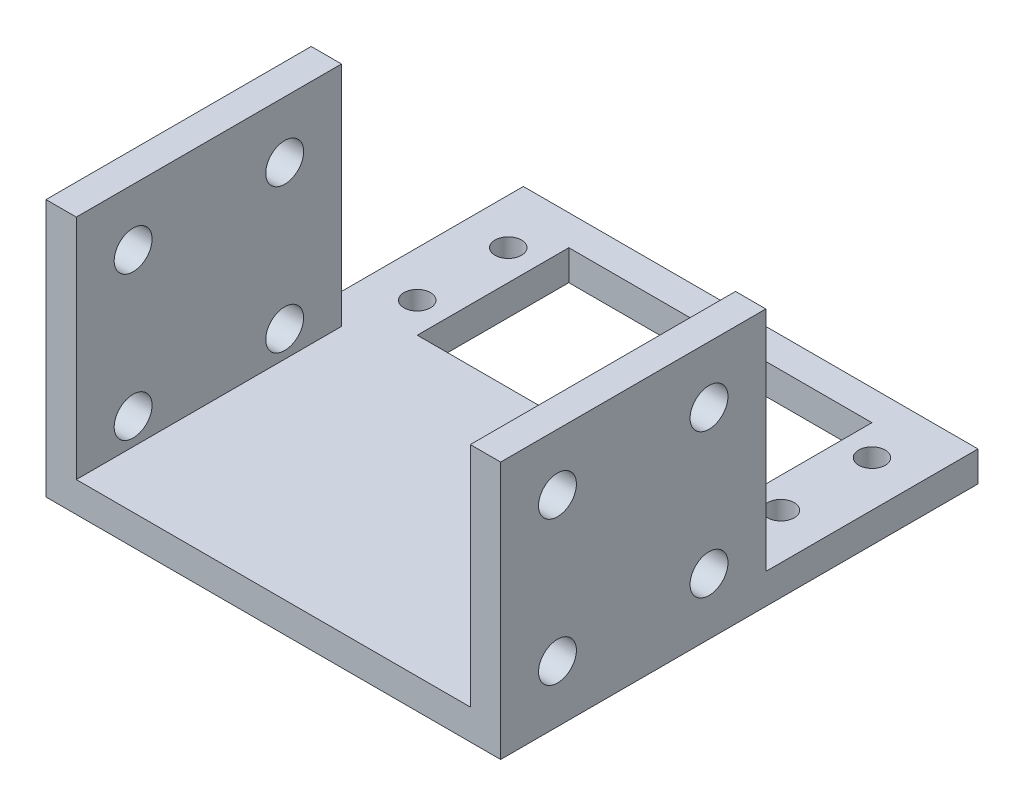
ISO-10303-21;
HEADER;
FILE_DESCRIPTION(('STEP AP214'),'2;1');
FILE_NAME('part.step','',(''),(''),'','','');
FILE_SCHEMA(('AUTOMOTIVE_DESIGN { 1 0 10303 214 1 1 1 1 }'));
ENDSEC;
DATA;
#1=APPLICATION_CONTEXT('core data for automotive mechanical design processes');
#2=APPLICATION_PROTOCOL_DEFINITION('international standard','automotive_design',2000,#1);
#3=PRODUCT_CONTEXT('',#1,'mechanical');
#4=PRODUCT('Part','Part','',(#3));
#5=PRODUCT_RELATED_PRODUCT_CATEGORY('part','',(#4));
#6=PRODUCT_DEFINITION_FORMATION('','',#4);
#7=PRODUCT_DEFINITION_CONTEXT('part definition',#1,'design');
#8=PRODUCT_DEFINITION('design','',#6,#7);
#9=PRODUCT_DEFINITION_SHAPE('','',#8);
#10=(LENGTH_UNIT() NAMED_UNIT(*) SI_UNIT(.MILLI.,.METRE.));
#11=(NAMED_UNIT(*) PLANE_ANGLE_UNIT() SI_UNIT($,.RADIAN.));
#12=(NAMED_UNIT(*) SI_UNIT($,.STERADIAN.) SOLID_ANGLE_UNIT());
#13=UNCERTAINTY_MEASURE_WITH_UNIT(LENGTH_MEASURE(1.E-05),#10,'distance_accuracy_value','');
#14=(GEOMETRIC_REPRESENTATION_CONTEXT(3) GLOBAL_UNCERTAINTY_ASSIGNED_CONTEXT((#13)) GLOBAL_UNIT_ASSIGNED_CONTEXT((#10,
#11,#12)) REPRESENTATION_CONTEXT('',''));
#15=CARTESIAN_POINT('',(0.,0.,0.));
#16=DIRECTION('',(0.,0.,1.));
#17=DIRECTION('',(1.,0.,0.));
#18=AXIS2_PLACEMENT_3D('',#15,#16,#17);
#19=CARTESIAN_POINT('',(20.,4.,0.));
#20=DIRECTION('',(-1.,0.,0.));
#21=DIRECTION('',(0.,0.,1.));
#22=AXIS2_PLACEMENT_3D('',#19,#20,#21);
#23=PLANE('',#22);
#24=DIRECTION('',(0.,0.,-1.));
#25=VECTOR('',#24,1.);
#26=CARTESIAN_POINT('',(20.,0.,0.));
#27=LINE('',#26,#25);
#28=CARTESIAN_POINT('',(20.,0.,10.));
#29=VERTEX_POINT('',#28);
#30=CARTESIAN_POINT('',(20.,0.,-10.));
#31=VERTEX_POINT('',#30);
#32=EDGE_CURVE('E168',#29,#31,#27,.T.);
#33=ORIENTED_EDGE('',*,*,#32,.F.);
#34=DIRECTION('',(0.,-1.,0.));
#35=VECTOR('',#34,1.);
#36=CARTESIAN_POINT('',(20.,4.,10.));
#37=LINE('',#36,#35);
#38=CARTESIAN_POINT('',(20.,4.,10.));
#39=VERTEX_POINT('',#38);
#40=EDGE_CURVE('E11',#39,#29,#37,.T.);
#41=ORIENTED_EDGE('',*,*,#40,.F.);
#42=DIRECTION('',(0.,0.,-1.));
#43=VECTOR('',#42,1.);
#44=CARTESIAN_POINT('',(20.,4.,0.));
#45=LINE('',#44,#43);
#46=CARTESIAN_POINT('',(20.,4.,-10.));
#47=VERTEX_POINT('',#46);
#48=EDGE_CURVE('E135',#39,#47,#45,.T.);
#49=ORIENTED_EDGE('',*,*,#48,.T.);
#50=DIRECTION('',(0.,-1.,0.));
#51=VECTOR('',#50,1.);
#52=CARTESIAN_POINT('',(20.,4.,-10.));
#53=LINE('',#52,#51);
#54=EDGE_CURVE('E90',#47,#31,#53,.T.);
#55=ORIENTED_EDGE('',*,*,#54,.T.);
#56=EDGE_LOOP('',(#33,#41,#49,#55));
#57=FACE_BOUND('',#56,.T.);
#58=ADVANCED_FACE('F41',(#57),#23,.T.);
#59=CARTESIAN_POINT('',(0.,4.,10.));
#60=DIRECTION('',(0.,0.,-1.));
#61=DIRECTION('',(-1.,0.,0.));
#62=AXIS2_PLACEMENT_3D('',#59,#60,#61);
#63=PLANE('',#62);
#64=DIRECTION('',(1.,0.,0.));
#65=VECTOR('',#64,1.);
#66=CARTESIAN_POINT('',(0.,0.,10.));
#67=LINE('',#66,#65);
#68=CARTESIAN_POINT('',(-20.,0.,10.));
#69=VERTEX_POINT('',#68);
#70=EDGE_CURVE('E124',#69,#29,#67,.T.);
#71=ORIENTED_EDGE('',*,*,#70,.F.);
#72=DIRECTION('',(0.,-1.,0.));
#73=VECTOR('',#72,1.);
#74=CARTESIAN_POINT('',(-20.,4.,10.));
#75=LINE('',#74,#73);
#76=CARTESIAN_POINT('',(-20.,4.,10.));
#77=VERTEX_POINT('',#76);
#78=EDGE_CURVE('E51',#77,#69,#75,.T.);
#79=ORIENTED_EDGE('',*,*,#78,.F.);
#80=DIRECTION('',(1.,0.,0.));
#81=VECTOR('',#80,1.);
#82=CARTESIAN_POINT('',(0.,4.,10.));
#83=LINE('',#82,#81);
#84=EDGE_CURVE('E122',#77,#39,#83,.T.);
#85=ORIENTED_EDGE('',*,*,#84,.T.);
#86=ORIENTED_EDGE('',*,*,#40,.T.);
#87=EDGE_LOOP('',(#71,#79,#85,#86));
#88=FACE_BOUND('',#87,.T.);
#89=ADVANCED_FACE('F120',(#88),#63,.T.);
#90=CARTESIAN_POINT('',(-20.,4.,0.));
#91=DIRECTION('',(-1.,0.,0.));
#92=DIRECTION('',(0.,0.,1.));
#93=AXIS2_PLACEMENT_3D('',#90,#91,#92);
#94=PLANE('',#93);
#95=DIRECTION('',(0.,0.,-1.));
#96=VECTOR('',#95,1.);
#97=CARTESIAN_POINT('',(-20.,0.,0.));
#98=LINE('',#97,#96);
#99=CARTESIAN_POINT('',(-20.,0.,-10.));
#100=VERTEX_POINT('',#99);
#101=EDGE_CURVE('E171',#69,#100,#98,.T.);
#102=ORIENTED_EDGE('',*,*,#101,.T.);
#103=DIRECTION('',(0.,-1.,0.));
#104=VECTOR('',#103,1.);
#105=CARTESIAN_POINT('',(-20.,4.,-10.));
#106=LINE('',#105,#104);
#107=CARTESIAN_POINT('',(-20.,4.,-10.));
#108=VERTEX_POINT('',#107);
#109=EDGE_CURVE('E127',#108,#100,#106,.T.);
#110=ORIENTED_EDGE('',*,*,#109,.F.);
#111=DIRECTION('',(0.,0.,-1.));
#112=VECTOR('',#111,1.);
#113=CARTESIAN_POINT('',(-20.,4.,0.));
#114=LINE('',#113,#112);
#115=EDGE_CURVE('E130',#77,#108,#114,.T.);
#116=ORIENTED_EDGE('',*,*,#115,.F.);
#117=ORIENTED_EDGE('',*,*,#78,.T.);
#118=EDGE_LOOP('',(#102,#110,#116,#117));
#119=FACE_BOUND('',#118,.T.);
#120=ADVANCED_FACE('F131',(#119),#94,.F.);
#121=CARTESIAN_POINT('',(30.,4.,0.));
#122=DIRECTION('',(1.,0.,0.));
#123=DIRECTION('',(0.,0.,-1.));
#124=AXIS2_PLACEMENT_3D('',#121,#122,#123);
#125=PLANE('',#124);
#126=CARTESIAN_POINT('',(30.,7.5,41.5));
#127=DIRECTION('',(1.,0.,0.));
#128=DIRECTION('',(0.,0.,-1.));
#129=AXIS2_PLACEMENT_3D('',#126,#127,#128);
#130=CIRCLE('',#129,2.5);
#131=CARTESIAN_POINT('',(30.,7.5,39.));
#132=VERTEX_POINT('',#131);
#133=EDGE_CURVE('E440',#132,#132,#130,.T.);
#134=ORIENTED_EDGE('',*,*,#133,.F.);
#135=EDGE_LOOP('',(#134));
#136=FACE_BOUND('',#135,.T.);
#137=CARTESIAN_POINT('',(30.,7.5,21.5));
#138=DIRECTION('',(1.,0.,0.));
#139=DIRECTION('',(0.,0.,-1.));
#140=AXIS2_PLACEMENT_3D('',#137,#138,#139);
#141=CIRCLE('',#140,2.5);
#142=CARTESIAN_POINT('',(30.,7.5,19.));
#143=VERTEX_POINT('',#142);
#144=EDGE_CURVE('E446',#143,#143,#141,.T.);
#145=ORIENTED_EDGE('',*,*,#144,.F.);
#146=EDGE_LOOP('',(#145));
#147=FACE_BOUND('',#146,.T.);
#148=CARTESIAN_POINT('',(30.,26.5,21.5));
#149=DIRECTION('',(1.,0.,0.));
#150=DIRECTION('',(0.,0.,-1.));
#151=AXIS2_PLACEMENT_3D('',#148,#149,#150);
#152=CIRCLE('',#151,2.5);
#153=CARTESIAN_POINT('',(30.,26.5,19.));
#154=VERTEX_POINT('',#153);
#155=EDGE_CURVE('E435',#154,#154,#152,.T.);
#156=ORIENTED_EDGE('',*,*,#155,.F.);
#157=EDGE_LOOP('',(#156));
#158=FACE_BOUND('',#157,.T.);
#159=CARTESIAN_POINT('',(30.,26.5,41.5));
#160=DIRECTION('',(1.,0.,0.));
#161=DIRECTION('',(0.,0.,-1.));
#162=AXIS2_PLACEMENT_3D('',#159,#160,#161);
#163=CIRCLE('',#162,2.5);
#164=CARTESIAN_POINT('',(30.,26.5,39.));
#165=VERTEX_POINT('',#164);
#166=EDGE_CURVE('E432',#165,#165,#163,.T.);
#167=ORIENTED_EDGE('',*,*,#166,.F.);
#168=EDGE_LOOP('',(#167));
#169=FACE_BOUND('',#168,.T.);
#170=DIRECTION('',(0.,0.,1.));
#171=VECTOR('',#170,1.);
#172=CARTESIAN_POINT('',(30.,0.,0.));
#173=LINE('',#172,#171);
#174=CARTESIAN_POINT('',(30.,0.,-14.));
#175=VERTEX_POINT('',#174);
#176=CARTESIAN_POINT('',(30.,0.,49.));
#177=VERTEX_POINT('',#176);
#178=EDGE_CURVE('E149',#175,#177,#173,.T.);
#179=ORIENTED_EDGE('',*,*,#178,.F.);
#180=DIRECTION('',(0.,-1.,0.));
#181=VECTOR('',#180,1.);
#182=CARTESIAN_POINT('',(30.,4.,-14.));
#183=LINE('',#182,#181);
#184=CARTESIAN_POINT('',(30.,4.,-14.));
#185=VERTEX_POINT('',#184);
#186=EDGE_CURVE('E97',#185,#175,#183,.T.);
#187=ORIENTED_EDGE('',*,*,#186,.F.);
#188=DIRECTION('',(0.,0.,1.));
#189=VECTOR('',#188,1.);
#190=CARTESIAN_POINT('',(30.,4.,0.));
#191=LINE('',#190,#189);
#192=CARTESIAN_POINT('',(30.,4.,14.));
#193=VERTEX_POINT('',#192);
#194=EDGE_CURVE('E262',#185,#193,#191,.T.);
#195=ORIENTED_EDGE('',*,*,#194,.T.);
#196=DIRECTION('',(0.,-1.,0.));
#197=VECTOR('',#196,1.);
#198=CARTESIAN_POINT('',(30.,34.,14.));
#199=LINE('',#198,#197);
#200=CARTESIAN_POINT('',(30.,34.,14.));
#201=VERTEX_POINT('',#200);
#202=EDGE_CURVE('E224',#201,#193,#199,.T.);
#203=ORIENTED_EDGE('',*,*,#202,.F.);
#204=DIRECTION('',(0.,0.,1.));
#205=VECTOR('',#204,1.);
#206=CARTESIAN_POINT('',(30.,34.,0.));
#207=LINE('',#206,#205);
#208=CARTESIAN_POINT('',(30.,34.,49.));
#209=VERTEX_POINT('',#208);
#210=EDGE_CURVE('E221',#201,#209,#207,.T.);
#211=ORIENTED_EDGE('',*,*,#210,.T.);
#212=DIRECTION('',(0.,-1.,0.));
#213=VECTOR('',#212,1.);
#214=CARTESIAN_POINT('',(30.,34.,49.));
#215=LINE('',#214,#213);
#216=EDGE_CURVE('E227',#209,#177,#215,.T.);
#217=ORIENTED_EDGE('',*,*,#216,.T.);
#218=EDGE_LOOP('',(#179,#187,#195,#203,#211,#217));
#219=FACE_BOUND('',#218,.T.);
#220=ADVANCED_FACE('F43',(#136,#147,#158,#169,#219),#125,.T.);
#221=CARTESIAN_POINT('',(0.,4.,-14.));
#222=DIRECTION('',(0.,0.,-1.));
#223=DIRECTION('',(-1.,0.,0.));
#224=AXIS2_PLACEMENT_3D('',#221,#222,#223);
#225=PLANE('',#224);
#226=DIRECTION('',(1.,0.,0.));
#227=VECTOR('',#226,1.);
#228=CARTESIAN_POINT('',(0.,0.,-14.));
#229=LINE('',#228,#227);
#230=CARTESIAN_POINT('',(-30.,0.,-14.));
#231=VERTEX_POINT('',#230);
#232=EDGE_CURVE('E152',#231,#175,#229,.T.);
#233=ORIENTED_EDGE('',*,*,#232,.F.);
#234=DIRECTION('',(0.,-1.,0.));
#235=VECTOR('',#234,1.);
#236=CARTESIAN_POINT('',(-30.,4.,-14.));
#237=LINE('',#236,#235);
#238=CARTESIAN_POINT('',(-30.,4.,-14.));
#239=VERTEX_POINT('',#238);
#240=EDGE_CURVE('E148',#239,#231,#237,.T.);
#241=ORIENTED_EDGE('',*,*,#240,.F.);
#242=DIRECTION('',(1.,0.,0.));
#243=VECTOR('',#242,1.);
#244=CARTESIAN_POINT('',(0.,4.,-14.));
#245=LINE('',#244,#243);
#246=EDGE_CURVE('E265',#239,#185,#245,.T.);
#247=ORIENTED_EDGE('',*,*,#246,.T.);
#248=ORIENTED_EDGE('',*,*,#186,.T.);
#249=EDGE_LOOP('',(#233,#241,#247,#248));
#250=FACE_BOUND('',#249,.T.);
#251=ADVANCED_FACE('F322',(#250),#225,.T.);
#252=CARTESIAN_POINT('',(-30.,4.,0.));
#253=DIRECTION('',(1.,0.,0.));
#254=DIRECTION('',(0.,0.,-1.));
#255=AXIS2_PLACEMENT_3D('',#252,#253,#254);
#256=PLANE('',#255);
#257=CARTESIAN_POINT('',(-30.,7.5,41.5));
#258=DIRECTION('',(1.,0.,0.));
#259=DIRECTION('',(0.,0.,-1.));
#260=AXIS2_PLACEMENT_3D('',#257,#258,#259);
#261=CIRCLE('',#260,2.5);
#262=CARTESIAN_POINT('',(-30.,7.5,39.));
#263=VERTEX_POINT('',#262);
#264=EDGE_CURVE('E437',#263,#263,#261,.T.);
#265=ORIENTED_EDGE('',*,*,#264,.T.);
#266=EDGE_LOOP('',(#265));
#267=FACE_BOUND('',#266,.T.);
#268=CARTESIAN_POINT('',(-30.,7.5,21.5));
#269=DIRECTION('',(1.,0.,0.));
#270=DIRECTION('',(0.,0.,-1.));
#271=AXIS2_PLACEMENT_3D('',#268,#269,#270);
#272=CIRCLE('',#271,2.5);
#273=CARTESIAN_POINT('',(-30.,7.5,19.));
#274=VERTEX_POINT('',#273);
#275=EDGE_CURVE('E443',#274,#274,#272,.T.);
#276=ORIENTED_EDGE('',*,*,#275,.T.);
#277=EDGE_LOOP('',(#276));
#278=FACE_BOUND('',#277,.T.);
#279=CARTESIAN_POINT('',(-30.,26.5,21.5));
#280=DIRECTION('',(1.,0.,0.));
#281=DIRECTION('',(0.,0.,-1.));
#282=AXIS2_PLACEMENT_3D('',#279,#280,#281);
#283=CIRCLE('',#282,2.5);
#284=CARTESIAN_POINT('',(-30.,26.5,19.));
#285=VERTEX_POINT('',#284);
#286=EDGE_CURVE('E449',#285,#285,#283,.T.);
#287=ORIENTED_EDGE('',*,*,#286,.T.);
#288=EDGE_LOOP('',(#287));
#289=FACE_BOUND('',#288,.T.);
#290=CARTESIAN_POINT('',(-30.,26.5,41.5));
#291=DIRECTION('',(1.,0.,0.));
#292=DIRECTION('',(0.,0.,-1.));
#293=AXIS2_PLACEMENT_3D('',#290,#291,#292);
#294=CIRCLE('',#293,2.5);
#295=CARTESIAN_POINT('',(-30.,26.5,39.));
#296=VERTEX_POINT('',#295);
#297=EDGE_CURVE('E189',#296,#296,#294,.T.);
#298=ORIENTED_EDGE('',*,*,#297,.T.);
#299=EDGE_LOOP('',(#298));
#300=FACE_BOUND('',#299,.T.);
#301=DIRECTION('',(0.,0.,1.));
#302=VECTOR('',#301,1.);
#303=CARTESIAN_POINT('',(-30.,0.,0.));
#304=LINE('',#303,#302);
#305=CARTESIAN_POINT('',(-30.,0.,49.));
#306=VERTEX_POINT('',#305);
#307=EDGE_CURVE('E156',#231,#306,#304,.T.);
#308=ORIENTED_EDGE('',*,*,#307,.T.);
#309=DIRECTION('',(0.,-1.,0.));
#310=VECTOR('',#309,1.);
#311=CARTESIAN_POINT('',(-30.,34.,49.));
#312=LINE('',#311,#310);
#313=CARTESIAN_POINT('',(-30.,34.,49.));
#314=VERTEX_POINT('',#313);
#315=EDGE_CURVE('E249',#314,#306,#312,.T.);
#316=ORIENTED_EDGE('',*,*,#315,.F.);
#317=DIRECTION('',(0.,0.,1.));
#318=VECTOR('',#317,1.);
#319=CARTESIAN_POINT('',(-30.,34.,0.));
#320=LINE('',#319,#318);
#321=CARTESIAN_POINT('',(-30.,34.,14.));
#322=VERTEX_POINT('',#321);
#323=EDGE_CURVE('E240',#322,#314,#320,.T.);
#324=ORIENTED_EDGE('',*,*,#323,.F.);
#325=DIRECTION('',(0.,-1.,0.));
#326=VECTOR('',#325,1.);
#327=CARTESIAN_POINT('',(-30.,34.,14.));
#328=LINE('',#327,#326);
#329=CARTESIAN_POINT('',(-30.,4.,14.));
#330=VERTEX_POINT('',#329);
#331=EDGE_CURVE('E252',#322,#330,#328,.T.);
#332=ORIENTED_EDGE('',*,*,#331,.T.);
#333=DIRECTION('',(0.,0.,1.));
#334=VECTOR('',#333,1.);
#335=CARTESIAN_POINT('',(-30.,4.,0.));
#336=LINE('',#335,#334);
#337=EDGE_CURVE('E268',#239,#330,#336,.T.);
#338=ORIENTED_EDGE('',*,*,#337,.F.);
#339=ORIENTED_EDGE('',*,*,#240,.T.);
#340=EDGE_LOOP('',(#308,#316,#324,#332,#338,#339));
#341=FACE_BOUND('',#340,.T.);
#342=ADVANCED_FACE('F319',(#267,#278,#289,#300,#341),#256,.F.);
#343=CARTESIAN_POINT('',(24.,4.,6.00709049106582));
#344=DIRECTION('',(0.,-1.,0.));
#345=DIRECTION('',(0.,0.,-1.));
#346=AXIS2_PLACEMENT_3D('',#343,#344,#345);
#347=CYLINDRICAL_SURFACE('',#346,1.75);
#348=CARTESIAN_POINT('',(24.,4.,6.00709049106582));
#349=DIRECTION('',(0.,1.,0.));
#350=DIRECTION('',(0.,0.,1.));
#351=AXIS2_PLACEMENT_3D('',#348,#349,#350);
#352=CIRCLE('',#351,1.75);
#353=CARTESIAN_POINT('',(24.,4.,7.75709049106582));
#354=VERTEX_POINT('',#353);
#355=EDGE_CURVE('E142',#354,#354,#352,.T.);
#356=ORIENTED_EDGE('',*,*,#355,.T.);
#357=EDGE_LOOP('',(#356));
#358=FACE_BOUND('',#357,.T.);
#359=CARTESIAN_POINT('',(24.,0.,6.00709049106582));
#360=DIRECTION('',(0.,1.,0.));
#361=DIRECTION('',(0.,0.,1.));
#362=AXIS2_PLACEMENT_3D('',#359,#360,#361);
#363=CIRCLE('',#362,1.75);
#364=CARTESIAN_POINT('',(24.,0.,7.75709049106582));
#365=VERTEX_POINT('',#364);
#366=EDGE_CURVE('E174',#365,#365,#363,.T.);
#367=ORIENTED_EDGE('',*,*,#366,.F.);
#368=EDGE_LOOP('',(#367));
#369=FACE_BOUND('',#368,.T.);
#370=ADVANCED_FACE('F321',(#358,#369),#347,.F.);
#371=CARTESIAN_POINT('',(0.,4.,-10.));
#372=DIRECTION('',(0.,0.,-1.));
#373=DIRECTION('',(-1.,0.,0.));
#374=AXIS2_PLACEMENT_3D('',#371,#372,#373);
#375=PLANE('',#374);
#376=DIRECTION('',(1.,0.,0.));
#377=VECTOR('',#376,1.);
#378=CARTESIAN_POINT('',(0.,0.,-10.));
#379=LINE('',#378,#377);
#380=EDGE_CURVE('E83',#100,#31,#379,.T.);
#381=ORIENTED_EDGE('',*,*,#380,.T.);
#382=ORIENTED_EDGE('',*,*,#54,.F.);
#383=DIRECTION('',(1.,0.,0.));
#384=VECTOR('',#383,1.);
#385=CARTESIAN_POINT('',(0.,4.,-10.));
#386=LINE('',#385,#384);
#387=EDGE_CURVE('E60',#108,#47,#386,.T.);
#388=ORIENTED_EDGE('',*,*,#387,.F.);
#389=ORIENTED_EDGE('',*,*,#109,.T.);
#390=EDGE_LOOP('',(#381,#382,#388,#389));
#391=FACE_BOUND('',#390,.T.);
#392=ADVANCED_FACE('F313',(#391),#375,.F.);
#393=CARTESIAN_POINT('',(-24.,4.,-6.00709049106583));
#394=DIRECTION('',(0.,-1.,0.));
#395=DIRECTION('',(0.,0.,-1.));
#396=AXIS2_PLACEMENT_3D('',#393,#394,#395);
#397=CYLINDRICAL_SURFACE('',#396,1.75);
#398=CARTESIAN_POINT('',(-24.,4.,-6.00709049106583));
#399=DIRECTION('',(0.,1.,0.));
#400=DIRECTION('',(0.,0.,1.));
#401=AXIS2_PLACEMENT_3D('',#398,#399,#400);
#402=CIRCLE('',#401,1.75);
#403=CARTESIAN_POINT('',(-24.,4.,-4.25709049106583));
#404=VERTEX_POINT('',#403);
#405=EDGE_CURVE('E137',#404,#404,#402,.T.);
#406=ORIENTED_EDGE('',*,*,#405,.T.);
#407=EDGE_LOOP('',(#406));
#408=FACE_BOUND('',#407,.T.);
#409=CARTESIAN_POINT('',(-24.,0.,-6.00709049106583));
#410=DIRECTION('',(0.,1.,0.));
#411=DIRECTION('',(0.,0.,1.));
#412=AXIS2_PLACEMENT_3D('',#409,#410,#411);
#413=CIRCLE('',#412,1.75);
#414=CARTESIAN_POINT('',(-24.,0.,-4.25709049106583));
#415=VERTEX_POINT('',#414);
#416=EDGE_CURVE('E165',#415,#415,#413,.T.);
#417=ORIENTED_EDGE('',*,*,#416,.F.);
#418=EDGE_LOOP('',(#417));
#419=FACE_BOUND('',#418,.T.);
#420=ADVANCED_FACE('F280',(#408,#419),#397,.F.);
#421=CARTESIAN_POINT('',(-24.,4.,6.00709049106583));
#422=DIRECTION('',(0.,-1.,0.));
#423=DIRECTION('',(0.,0.,-1.));
#424=AXIS2_PLACEMENT_3D('',#421,#422,#423);
#425=CYLINDRICAL_SURFACE('',#424,1.75);
#426=CARTESIAN_POINT('',(-24.,4.,6.00709049106583));
#427=DIRECTION('',(0.,1.,0.));
#428=DIRECTION('',(0.,0.,1.));
#429=AXIS2_PLACEMENT_3D('',#426,#427,#428);
#430=CIRCLE('',#429,1.75);
#431=CARTESIAN_POINT('',(-24.,4.,7.75709049106583));
#432=VERTEX_POINT('',#431);
#433=EDGE_CURVE('E275',#432,#432,#430,.F.);
#434=ORIENTED_EDGE('',*,*,#433,.F.);
#435=EDGE_LOOP('',(#434));
#436=FACE_BOUND('',#435,.T.);
#437=CARTESIAN_POINT('',(-24.,0.,6.00709049106583));
#438=DIRECTION('',(0.,1.,0.));
#439=DIRECTION('',(0.,0.,1.));
#440=AXIS2_PLACEMENT_3D('',#437,#438,#439);
#441=CIRCLE('',#440,1.75);
#442=CARTESIAN_POINT('',(-24.,0.,7.75709049106583));
#443=VERTEX_POINT('',#442);
#444=EDGE_CURVE('E162',#443,#443,#441,.F.);
#445=ORIENTED_EDGE('',*,*,#444,.T.);
#446=EDGE_LOOP('',(#445));
#447=FACE_BOUND('',#446,.T.);
#448=ADVANCED_FACE('F312',(#436,#447),#425,.F.);
#449=CARTESIAN_POINT('',(0.,4.,49.));
#450=DIRECTION('',(0.,0.,-1.));
#451=DIRECTION('',(-1.,0.,0.));
#452=AXIS2_PLACEMENT_3D('',#449,#450,#451);
#453=PLANE('',#452);
#454=DIRECTION('',(1.,0.,0.));
#455=VECTOR('',#454,1.);
#456=CARTESIAN_POINT('',(0.,0.,49.));
#457=LINE('',#456,#455);
#458=EDGE_CURVE('E159',#306,#177,#457,.T.);
#459=ORIENTED_EDGE('',*,*,#458,.T.);
#460=ORIENTED_EDGE('',*,*,#216,.F.);
#461=DIRECTION('',(1.,0.,0.));
#462=VECTOR('',#461,1.);
#463=CARTESIAN_POINT('',(0.,34.,49.));
#464=LINE('',#463,#462);
#465=CARTESIAN_POINT('',(26.,34.,49.));
#466=VERTEX_POINT('',#465);
#467=EDGE_CURVE('E218',#466,#209,#464,.T.);
#468=ORIENTED_EDGE('',*,*,#467,.F.);
#469=DIRECTION('',(0.,-1.,0.));
#470=VECTOR('',#469,1.);
#471=CARTESIAN_POINT('',(26.,34.,49.));
#472=LINE('',#471,#470);
#473=CARTESIAN_POINT('',(26.,4.,49.));
#474=VERTEX_POINT('',#473);
#475=EDGE_CURVE('E230',#466,#474,#472,.T.);
#476=ORIENTED_EDGE('',*,*,#475,.T.);
#477=DIRECTION('',(1.,0.,0.));
#478=VECTOR('',#477,1.);
#479=CARTESIAN_POINT('',(0.,4.,49.));
#480=LINE('',#479,#478);
#481=CARTESIAN_POINT('',(-26.,4.,49.));
#482=VERTEX_POINT('',#481);
#483=EDGE_CURVE('E272',#482,#474,#480,.T.);
#484=ORIENTED_EDGE('',*,*,#483,.F.);
#485=DIRECTION('',(0.,-1.,0.));
#486=VECTOR('',#485,1.);
#487=CARTESIAN_POINT('',(-26.,34.,49.));
#488=LINE('',#487,#486);
#489=CARTESIAN_POINT('',(-26.,34.,49.));
#490=VERTEX_POINT('',#489);
#491=EDGE_CURVE('E246',#490,#482,#488,.T.);
#492=ORIENTED_EDGE('',*,*,#491,.F.);
#493=DIRECTION('',(1.,0.,0.));
#494=VECTOR('',#493,1.);
#495=CARTESIAN_POINT('',(0.,34.,49.));
#496=LINE('',#495,#494);
#497=EDGE_CURVE('E243',#314,#490,#496,.T.);
#498=ORIENTED_EDGE('',*,*,#497,.F.);
#499=ORIENTED_EDGE('',*,*,#315,.T.);
#500=EDGE_LOOP('',(#459,#460,#468,#476,#484,#492,#498,#499));
#501=FACE_BOUND('',#500,.T.);
#502=ADVANCED_FACE('F296',(#501),#453,.F.);
#503=CARTESIAN_POINT('',(24.,4.,-6.00709049106583));
#504=DIRECTION('',(0.,-1.,0.));
#505=DIRECTION('',(0.,0.,-1.));
#506=AXIS2_PLACEMENT_3D('',#503,#504,#505);
#507=CYLINDRICAL_SURFACE('',#506,1.75);
#508=CARTESIAN_POINT('',(24.,4.,-6.00709049106583));
#509=DIRECTION('',(0.,1.,0.));
#510=DIRECTION('',(0.,0.,1.));
#511=AXIS2_PLACEMENT_3D('',#508,#509,#510);
#512=CIRCLE('',#511,1.75);
#513=CARTESIAN_POINT('',(24.,4.,-4.25709049106583));
#514=VERTEX_POINT('',#513);
#515=EDGE_CURVE('E145',#514,#514,#512,.F.);
#516=ORIENTED_EDGE('',*,*,#515,.F.);
#517=EDGE_LOOP('',(#516));
#518=FACE_BOUND('',#517,.T.);
#519=CARTESIAN_POINT('',(24.,0.,-6.00709049106583));
#520=DIRECTION('',(0.,1.,0.));
#521=DIRECTION('',(0.,0.,1.));
#522=AXIS2_PLACEMENT_3D('',#519,#520,#521);
#523=CIRCLE('',#522,1.75);
#524=CARTESIAN_POINT('',(24.,0.,-4.25709049106583));
#525=VERTEX_POINT('',#524);
#526=EDGE_CURVE('E177',#525,#525,#523,.F.);
#527=ORIENTED_EDGE('',*,*,#526,.T.);
#528=EDGE_LOOP('',(#527));
#529=FACE_BOUND('',#528,.T.);
#530=ADVANCED_FACE('F285',(#518,#529),#507,.F.);
#531=CARTESIAN_POINT('',(0.,4.,0.));
#532=DIRECTION('',(0.,1.,0.));
#533=DIRECTION('',(0.,0.,1.));
#534=AXIS2_PLACEMENT_3D('',#531,#532,#533);
#535=PLANE('',#534);
#536=DIRECTION('',(0.,0.,1.));
#537=VECTOR('',#536,1.);
#538=CARTESIAN_POINT('',(26.,4.,0.));
#539=LINE('',#538,#537);
#540=CARTESIAN_POINT('',(26.,4.,14.));
#541=VERTEX_POINT('',#540);
#542=EDGE_CURVE('E180',#541,#474,#539,.T.);
#543=ORIENTED_EDGE('',*,*,#542,.F.);
#544=DIRECTION('',(1.,0.,0.));
#545=VECTOR('',#544,1.);
#546=CARTESIAN_POINT('',(0.,4.,14.));
#547=LINE('',#546,#545);
#548=EDGE_CURVE('E259',#541,#193,#547,.T.);
#549=ORIENTED_EDGE('',*,*,#548,.T.);
#550=ORIENTED_EDGE('',*,*,#194,.F.);
#551=ORIENTED_EDGE('',*,*,#246,.F.);
#552=ORIENTED_EDGE('',*,*,#337,.T.);
#553=CARTESIAN_POINT('',(-26.,4.,14.));
#554=VERTEX_POINT('',#553);
#555=EDGE_CURVE('E263',#330,#554,#547,.T.);
#556=ORIENTED_EDGE('',*,*,#555,.T.);
#557=DIRECTION('',(0.,0.,1.));
#558=VECTOR('',#557,1.);
#559=CARTESIAN_POINT('',(-26.,4.,0.));
#560=LINE('',#559,#558);
#561=EDGE_CURVE('E270',#554,#482,#560,.T.);
#562=ORIENTED_EDGE('',*,*,#561,.T.);
#563=ORIENTED_EDGE('',*,*,#483,.T.);
#564=EDGE_LOOP('',(#543,#549,#550,#551,#552,#556,#562,#563));
#565=FACE_BOUND('',#564,.T.);
#566=ORIENTED_EDGE('',*,*,#433,.T.);
#567=EDGE_LOOP('',(#566));
#568=FACE_BOUND('',#567,.T.);
#569=ORIENTED_EDGE('',*,*,#405,.F.);
#570=EDGE_LOOP('',(#569));
#571=FACE_BOUND('',#570,.T.);
#572=ORIENTED_EDGE('',*,*,#48,.F.);
#573=ORIENTED_EDGE('',*,*,#84,.F.);
#574=ORIENTED_EDGE('',*,*,#115,.T.);
#575=ORIENTED_EDGE('',*,*,#387,.T.);
#576=EDGE_LOOP('',(#572,#573,#574,#575));
#577=FACE_BOUND('',#576,.T.);
#578=ORIENTED_EDGE('',*,*,#355,.F.);
#579=EDGE_LOOP('',(#578));
#580=FACE_BOUND('',#579,.T.);
#581=ORIENTED_EDGE('',*,*,#515,.T.);
#582=EDGE_LOOP('',(#581));
#583=FACE_BOUND('',#582,.T.);
#584=ADVANCED_FACE('F133',(#565,#568,#571,#577,#580,#583),#535,.T.);
#585=CARTESIAN_POINT('',(0.,0.,0.));
#586=DIRECTION('',(0.,1.,0.));
#587=DIRECTION('',(0.,0.,1.));
#588=AXIS2_PLACEMENT_3D('',#585,#586,#587);
#589=PLANE('',#588);
#590=ORIENTED_EDGE('',*,*,#178,.T.);
#591=ORIENTED_EDGE('',*,*,#458,.F.);
#592=ORIENTED_EDGE('',*,*,#307,.F.);
#593=ORIENTED_EDGE('',*,*,#232,.T.);
#594=EDGE_LOOP('',(#590,#591,#592,#593));
#595=FACE_BOUND('',#594,.T.);
#596=ORIENTED_EDGE('',*,*,#444,.F.);
#597=EDGE_LOOP('',(#596));
#598=FACE_BOUND('',#597,.T.);
#599=ORIENTED_EDGE('',*,*,#416,.T.);
#600=EDGE_LOOP('',(#599));
#601=FACE_BOUND('',#600,.T.);
#602=ORIENTED_EDGE('',*,*,#32,.T.);
#603=ORIENTED_EDGE('',*,*,#380,.F.);
#604=ORIENTED_EDGE('',*,*,#101,.F.);
#605=ORIENTED_EDGE('',*,*,#70,.T.);
#606=EDGE_LOOP('',(#602,#603,#604,#605));
#607=FACE_BOUND('',#606,.T.);
#608=ORIENTED_EDGE('',*,*,#366,.T.);
#609=EDGE_LOOP('',(#608));
#610=FACE_BOUND('',#609,.T.);
#611=ORIENTED_EDGE('',*,*,#526,.F.);
#612=EDGE_LOOP('',(#611));
#613=FACE_BOUND('',#612,.T.);
#614=ADVANCED_FACE('F284',(#595,#598,#601,#607,#610,#613),#589,.F.);
#615=CARTESIAN_POINT('',(-26.,34.,0.));
#616=DIRECTION('',(1.,0.,0.));
#617=DIRECTION('',(0.,0.,-1.));
#618=AXIS2_PLACEMENT_3D('',#615,#616,#617);
#619=PLANE('',#618);
#620=CARTESIAN_POINT('',(-26.,7.5,41.5));
#621=DIRECTION('',(1.,0.,0.));
#622=DIRECTION('',(0.,0.,-1.));
#623=AXIS2_PLACEMENT_3D('',#620,#621,#622);
#624=CIRCLE('',#623,2.5);
#625=CARTESIAN_POINT('',(-26.,7.5,39.));
#626=VERTEX_POINT('',#625);
#627=EDGE_CURVE('E207',#626,#626,#624,.T.);
#628=ORIENTED_EDGE('',*,*,#627,.F.);
#629=EDGE_LOOP('',(#628));
#630=FACE_BOUND('',#629,.T.);
#631=CARTESIAN_POINT('',(-26.,7.5,21.5));
#632=DIRECTION('',(1.,0.,0.));
#633=DIRECTION('',(0.,0.,-1.));
#634=AXIS2_PLACEMENT_3D('',#631,#632,#633);
#635=CIRCLE('',#634,2.5);
#636=CARTESIAN_POINT('',(-26.,7.5,19.));
#637=VERTEX_POINT('',#636);
#638=EDGE_CURVE('E195',#637,#637,#635,.T.);
#639=ORIENTED_EDGE('',*,*,#638,.F.);
#640=EDGE_LOOP('',(#639));
#641=FACE_BOUND('',#640,.T.);
#642=CARTESIAN_POINT('',(-26.,26.5,21.5));
#643=DIRECTION('',(1.,0.,0.));
#644=DIRECTION('',(0.,0.,-1.));
#645=AXIS2_PLACEMENT_3D('',#642,#643,#644);
#646=CIRCLE('',#645,2.5);
#647=CARTESIAN_POINT('',(-26.,26.5,19.));
#648=VERTEX_POINT('',#647);
#649=EDGE_CURVE('E192',#648,#648,#646,.T.);
#650=ORIENTED_EDGE('',*,*,#649,.F.);
#651=EDGE_LOOP('',(#650));
#652=FACE_BOUND('',#651,.T.);
#653=CARTESIAN_POINT('',(-26.,26.5,41.5));
#654=DIRECTION('',(1.,0.,0.));
#655=DIRECTION('',(0.,0.,-1.));
#656=AXIS2_PLACEMENT_3D('',#653,#654,#655);
#657=CIRCLE('',#656,2.5);
#658=CARTESIAN_POINT('',(-26.,26.5,39.));
#659=VERTEX_POINT('',#658);
#660=EDGE_CURVE('E188',#659,#659,#657,.T.);
#661=ORIENTED_EDGE('',*,*,#660,.F.);
#662=EDGE_LOOP('',(#661));
#663=FACE_BOUND('',#662,.T.);
#664=ORIENTED_EDGE('',*,*,#491,.T.);
#665=ORIENTED_EDGE('',*,*,#561,.F.);
#666=DIRECTION('',(0.,-1.,0.));
#667=VECTOR('',#666,1.);
#668=CARTESIAN_POINT('',(-26.,34.,14.));
#669=LINE('',#668,#667);
#670=CARTESIAN_POINT('',(-26.,34.,14.));
#671=VERTEX_POINT('',#670);
#672=EDGE_CURVE('E215',#671,#554,#669,.T.);
#673=ORIENTED_EDGE('',*,*,#672,.F.);
#674=DIRECTION('',(0.,0.,1.));
#675=VECTOR('',#674,1.);
#676=CARTESIAN_POINT('',(-26.,34.,0.));
#677=LINE('',#676,#675);
#678=EDGE_CURVE('E210',#671,#490,#677,.T.);
#679=ORIENTED_EDGE('',*,*,#678,.T.);
#680=EDGE_LOOP('',(#664,#665,#673,#679));
#681=FACE_BOUND('',#680,.T.);
#682=ADVANCED_FACE('F292',(#630,#641,#652,#663,#681),#619,.T.);
#683=CARTESIAN_POINT('',(0.,34.,14.));
#684=DIRECTION('',(0.,0.,-1.));
#685=DIRECTION('',(-1.,0.,0.));
#686=AXIS2_PLACEMENT_3D('',#683,#684,#685);
#687=PLANE('',#686);
#688=ORIENTED_EDGE('',*,*,#672,.T.);
#689=ORIENTED_EDGE('',*,*,#555,.F.);
#690=ORIENTED_EDGE('',*,*,#331,.F.);
#691=DIRECTION('',(1.,0.,0.));
#692=VECTOR('',#691,1.);
#693=CARTESIAN_POINT('',(0.,34.,14.));
#694=LINE('',#693,#692);
#695=EDGE_CURVE('E237',#322,#671,#694,.T.);
#696=ORIENTED_EDGE('',*,*,#695,.T.);
#697=EDGE_LOOP('',(#688,#689,#690,#696));
#698=FACE_BOUND('',#697,.T.);
#699=ADVANCED_FACE('F381',(#698),#687,.T.);
#700=CARTESIAN_POINT('',(0.,34.,0.));
#701=DIRECTION('',(0.,1.,0.));
#702=DIRECTION('',(0.,0.,1.));
#703=AXIS2_PLACEMENT_3D('',#700,#701,#702);
#704=PLANE('',#703);
#705=ORIENTED_EDGE('',*,*,#678,.F.);
#706=ORIENTED_EDGE('',*,*,#695,.F.);
#707=ORIENTED_EDGE('',*,*,#323,.T.);
#708=ORIENTED_EDGE('',*,*,#497,.T.);
#709=EDGE_LOOP('',(#705,#706,#707,#708));
#710=FACE_BOUND('',#709,.T.);
#711=ADVANCED_FACE('F354',(#710),#704,.T.);
#712=CARTESIAN_POINT('',(0.,34.,14.));
#713=DIRECTION('',(0.,0.,-1.));
#714=DIRECTION('',(-1.,0.,0.));
#715=AXIS2_PLACEMENT_3D('',#712,#713,#714);
#716=PLANE('',#715);
#717=ORIENTED_EDGE('',*,*,#202,.T.);
#718=ORIENTED_EDGE('',*,*,#548,.F.);
#719=DIRECTION('',(0.,-1.,0.));
#720=VECTOR('',#719,1.);
#721=CARTESIAN_POINT('',(26.,34.,14.));
#722=LINE('',#721,#720);
#723=CARTESIAN_POINT('',(26.,34.,14.));
#724=VERTEX_POINT('',#723);
#725=EDGE_CURVE('E153',#724,#541,#722,.T.);
#726=ORIENTED_EDGE('',*,*,#725,.F.);
#727=DIRECTION('',(1.,0.,0.));
#728=VECTOR('',#727,1.);
#729=CARTESIAN_POINT('',(0.,34.,14.));
#730=LINE('',#729,#728);
#731=EDGE_CURVE('E211',#724,#201,#730,.T.);
#732=ORIENTED_EDGE('',*,*,#731,.T.);
#733=EDGE_LOOP('',(#717,#718,#726,#732));
#734=FACE_BOUND('',#733,.T.);
#735=ADVANCED_FACE('F369',(#734),#716,.T.);
#736=CARTESIAN_POINT('',(26.,34.,0.));
#737=DIRECTION('',(1.,0.,0.));
#738=DIRECTION('',(0.,0.,-1.));
#739=AXIS2_PLACEMENT_3D('',#736,#737,#738);
#740=PLANE('',#739);
#741=CARTESIAN_POINT('',(26.,7.5,41.5));
#742=DIRECTION('',(1.,0.,0.));
#743=DIRECTION('',(0.,0.,-1.));
#744=AXIS2_PLACEMENT_3D('',#741,#742,#743);
#745=CIRCLE('',#744,2.5);
#746=CARTESIAN_POINT('',(26.,7.5,39.));
#747=VERTEX_POINT('',#746);
#748=EDGE_CURVE('E45',#747,#747,#745,.T.);
#749=ORIENTED_EDGE('',*,*,#748,.T.);
#750=EDGE_LOOP('',(#749));
#751=FACE_BOUND('',#750,.T.);
#752=CARTESIAN_POINT('',(26.,7.5,21.5));
#753=DIRECTION('',(1.,0.,0.));
#754=DIRECTION('',(0.,0.,-1.));
#755=AXIS2_PLACEMENT_3D('',#752,#753,#754);
#756=CIRCLE('',#755,2.5);
#757=CARTESIAN_POINT('',(26.,7.5,19.));
#758=VERTEX_POINT('',#757);
#759=EDGE_CURVE('E193',#758,#758,#756,.T.);
#760=ORIENTED_EDGE('',*,*,#759,.T.);
#761=EDGE_LOOP('',(#760));
#762=FACE_BOUND('',#761,.T.);
#763=CARTESIAN_POINT('',(26.,26.5,21.5));
#764=DIRECTION('',(1.,0.,0.));
#765=DIRECTION('',(0.,0.,-1.));
#766=AXIS2_PLACEMENT_3D('',#763,#764,#765);
#767=CIRCLE('',#766,2.5);
#768=CARTESIAN_POINT('',(26.,26.5,19.));
#769=VERTEX_POINT('',#768);
#770=EDGE_CURVE('E190',#769,#769,#767,.T.);
#771=ORIENTED_EDGE('',*,*,#770,.T.);
#772=EDGE_LOOP('',(#771));
#773=FACE_BOUND('',#772,.T.);
#774=CARTESIAN_POINT('',(26.,26.5,41.5));
#775=DIRECTION('',(1.,0.,0.));
#776=DIRECTION('',(0.,0.,-1.));
#777=AXIS2_PLACEMENT_3D('',#774,#775,#776);
#778=CIRCLE('',#777,2.5);
#779=CARTESIAN_POINT('',(26.,26.5,39.));
#780=VERTEX_POINT('',#779);
#781=EDGE_CURVE('E185',#780,#780,#778,.T.);
#782=ORIENTED_EDGE('',*,*,#781,.T.);
#783=EDGE_LOOP('',(#782));
#784=FACE_BOUND('',#783,.T.);
#785=ORIENTED_EDGE('',*,*,#542,.T.);
#786=ORIENTED_EDGE('',*,*,#475,.F.);
#787=DIRECTION('',(0.,0.,1.));
#788=VECTOR('',#787,1.);
#789=CARTESIAN_POINT('',(26.,34.,0.));
#790=LINE('',#789,#788);
#791=EDGE_CURVE('E214',#724,#466,#790,.T.);
#792=ORIENTED_EDGE('',*,*,#791,.F.);
#793=ORIENTED_EDGE('',*,*,#725,.T.);
#794=EDGE_LOOP('',(#785,#786,#792,#793));
#795=FACE_BOUND('',#794,.T.);
#796=ADVANCED_FACE('F372',(#751,#762,#773,#784,#795),#740,.F.);
#797=CARTESIAN_POINT('',(0.,34.,0.));
#798=DIRECTION('',(0.,1.,0.));
#799=DIRECTION('',(0.,0.,1.));
#800=AXIS2_PLACEMENT_3D('',#797,#798,#799);
#801=PLANE('',#800);
#802=ORIENTED_EDGE('',*,*,#731,.F.);
#803=ORIENTED_EDGE('',*,*,#791,.T.);
#804=ORIENTED_EDGE('',*,*,#467,.T.);
#805=ORIENTED_EDGE('',*,*,#210,.F.);
#806=EDGE_LOOP('',(#802,#803,#804,#805));
#807=FACE_BOUND('',#806,.T.);
#808=ADVANCED_FACE('F390',(#807),#801,.T.);
#809=CARTESIAN_POINT('',(-30.,26.5,41.5));
#810=DIRECTION('',(1.,0.,0.));
#811=DIRECTION('',(0.,0.,-1.));
#812=AXIS2_PLACEMENT_3D('',#809,#810,#811);
#813=CYLINDRICAL_SURFACE('',#812,2.5);
#814=ORIENTED_EDGE('',*,*,#166,.T.);
#815=EDGE_LOOP('',(#814));
#816=FACE_BOUND('',#815,.T.);
#817=ORIENTED_EDGE('',*,*,#781,.F.);
#818=EDGE_LOOP('',(#817));
#819=FACE_BOUND('',#818,.T.);
#820=ADVANCED_FACE('F394',(#816,#819),#813,.F.);
#821=CARTESIAN_POINT('',(-30.,26.5,21.5));
#822=DIRECTION('',(1.,0.,0.));
#823=DIRECTION('',(0.,0.,-1.));
#824=AXIS2_PLACEMENT_3D('',#821,#822,#823);
#825=CYLINDRICAL_SURFACE('',#824,2.5);
#826=ORIENTED_EDGE('',*,*,#155,.T.);
#827=EDGE_LOOP('',(#826));
#828=FACE_BOUND('',#827,.T.);
#829=ORIENTED_EDGE('',*,*,#770,.F.);
#830=EDGE_LOOP('',(#829));
#831=FACE_BOUND('',#830,.T.);
#832=ADVANCED_FACE('F400',(#828,#831),#825,.F.);
#833=CARTESIAN_POINT('',(-30.,7.5,21.5));
#834=DIRECTION('',(1.,0.,0.));
#835=DIRECTION('',(0.,0.,-1.));
#836=AXIS2_PLACEMENT_3D('',#833,#834,#835);
#837=CYLINDRICAL_SURFACE('',#836,2.5);
#838=ORIENTED_EDGE('',*,*,#144,.T.);
#839=EDGE_LOOP('',(#838));
#840=FACE_BOUND('',#839,.T.);
#841=ORIENTED_EDGE('',*,*,#759,.F.);
#842=EDGE_LOOP('',(#841));
#843=FACE_BOUND('',#842,.T.);
#844=ADVANCED_FACE('F463',(#840,#843),#837,.F.);
#845=CARTESIAN_POINT('',(-30.,7.5,41.5));
#846=DIRECTION('',(1.,0.,0.));
#847=DIRECTION('',(0.,0.,-1.));
#848=AXIS2_PLACEMENT_3D('',#845,#846,#847);
#849=CYLINDRICAL_SURFACE('',#848,2.5);
#850=ORIENTED_EDGE('',*,*,#133,.T.);
#851=EDGE_LOOP('',(#850));
#852=FACE_BOUND('',#851,.T.);
#853=ORIENTED_EDGE('',*,*,#748,.F.);
#854=EDGE_LOOP('',(#853));
#855=FACE_BOUND('',#854,.T.);
#856=ADVANCED_FACE('F428',(#852,#855),#849,.F.);
#857=ORIENTED_EDGE('',*,*,#660,.T.);
#858=EDGE_LOOP('',(#857));
#859=FACE_BOUND('',#858,.T.);
#860=ORIENTED_EDGE('',*,*,#297,.F.);
#861=EDGE_LOOP('',(#860));
#862=FACE_BOUND('',#861,.T.);
#863=ADVANCED_FACE('F403',(#859,#862),#813,.F.);
#864=ORIENTED_EDGE('',*,*,#649,.T.);
#865=EDGE_LOOP('',(#864));
#866=FACE_BOUND('',#865,.T.);
#867=ORIENTED_EDGE('',*,*,#286,.F.);
#868=EDGE_LOOP('',(#867));
#869=FACE_BOUND('',#868,.T.);
#870=ADVANCED_FACE('F427',(#866,#869),#825,.F.);
#871=ORIENTED_EDGE('',*,*,#638,.T.);
#872=EDGE_LOOP('',(#871));
#873=FACE_BOUND('',#872,.T.);
#874=ORIENTED_EDGE('',*,*,#275,.F.);
#875=EDGE_LOOP('',(#874));
#876=FACE_BOUND('',#875,.T.);
#877=ADVANCED_FACE('F472',(#873,#876),#837,.F.);
#878=ORIENTED_EDGE('',*,*,#627,.T.);
#879=EDGE_LOOP('',(#878));
#880=FACE_BOUND('',#879,.T.);
#881=ORIENTED_EDGE('',*,*,#264,.F.);
#882=EDGE_LOOP('',(#881));
#883=FACE_BOUND('',#882,.T.);
#884=ADVANCED_FACE('F477',(#880,#883),#849,.F.);
#885=CLOSED_SHELL('',(#58,#89,#120,#220,#251,#342,#370,#392,#420,#448,#502,#530,#584,#614,#682,
#699,#711,#735,#796,#808,#820,#832,#844,#856,#863,#870,#877,#884));
#886=MANIFOLD_SOLID_BREP('B2',#885);
#887=ADVANCED_BREP_SHAPE_REPRESENTATION('',(#18,#886),#14);
#888=SHAPE_DEFINITION_REPRESENTATION(#9,#887);
ENDSEC;
END-ISO-10303-21;
